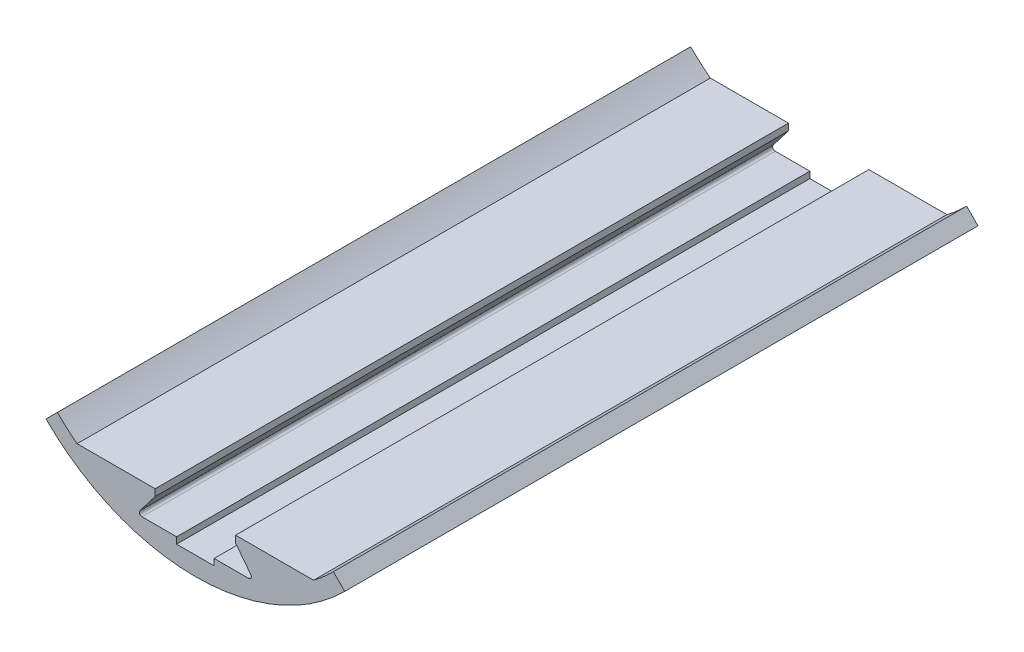
ISO-10303-21;
HEADER;
FILE_DESCRIPTION(('STEP AP214'),'2;1');
FILE_NAME('part.step','',(''),(''),'','','');
FILE_SCHEMA(('AUTOMOTIVE_DESIGN { 1 0 10303 214 1 1 1 1 }'));
ENDSEC;
DATA;
#1=APPLICATION_CONTEXT('core data for automotive mechanical design processes');
#2=APPLICATION_PROTOCOL_DEFINITION('international standard','automotive_design',2000,#1);
#3=PRODUCT_CONTEXT('',#1,'mechanical');
#4=PRODUCT('Part','Part','',(#3));
#5=PRODUCT_RELATED_PRODUCT_CATEGORY('part','',(#4));
#6=PRODUCT_DEFINITION_FORMATION('','',#4);
#7=PRODUCT_DEFINITION_CONTEXT('part definition',#1,'design');
#8=PRODUCT_DEFINITION('design','',#6,#7);
#9=PRODUCT_DEFINITION_SHAPE('','',#8);
#10=(LENGTH_UNIT() NAMED_UNIT(*) SI_UNIT(.MILLI.,.METRE.));
#11=(NAMED_UNIT(*) PLANE_ANGLE_UNIT() SI_UNIT($,.RADIAN.));
#12=(NAMED_UNIT(*) SI_UNIT($,.STERADIAN.) SOLID_ANGLE_UNIT());
#13=UNCERTAINTY_MEASURE_WITH_UNIT(LENGTH_MEASURE(1.E-05),#10,'distance_accuracy_value','');
#14=(GEOMETRIC_REPRESENTATION_CONTEXT(3) GLOBAL_UNCERTAINTY_ASSIGNED_CONTEXT((#13)) GLOBAL_UNIT_ASSIGNED_CONTEXT((#10,
#11,#12)) REPRESENTATION_CONTEXT('',''));
#15=CARTESIAN_POINT('',(0.,0.,0.));
#16=DIRECTION('',(0.,0.,1.));
#17=DIRECTION('',(1.,0.,0.));
#18=AXIS2_PLACEMENT_3D('',#15,#16,#17);
#19=CARTESIAN_POINT('',(0.,0.,-150.));
#20=DIRECTION('',(0.,0.,1.));
#21=DIRECTION('',(1.,0.,0.));
#22=AXIS2_PLACEMENT_3D('',#19,#20,#21);
#23=CYLINDRICAL_SURFACE('',#22,46.228);
#24=DIRECTION('',(0.,0.,1.));
#25=VECTOR('',#24,1.);
#26=CARTESIAN_POINT('',(28.0112005990461,-36.775,-206.814334854859));
#27=LINE('',#26,#25);
#28=CARTESIAN_POINT('',(28.0112005990461,-36.775,-150.));
#29=VERTEX_POINT('',#28);
#30=CARTESIAN_POINT('',(28.0112005990461,-36.775,0.));
#31=VERTEX_POINT('',#30);
#32=EDGE_CURVE('E177',#29,#31,#27,.T.);
#33=ORIENTED_EDGE('',*,*,#32,.T.);
#34=CARTESIAN_POINT('',(0.,0.,0.));
#35=DIRECTION('',(0.,0.,1.));
#36=DIRECTION('',(1.,0.,0.));
#37=AXIS2_PLACEMENT_3D('',#34,#35,#36);
#38=CIRCLE('',#37,46.228);
#39=CARTESIAN_POINT('',(32.6881322806918,-32.6881322806917,0.));
#40=VERTEX_POINT('',#39);
#41=EDGE_CURVE('E164',#31,#40,#38,.T.);
#42=ORIENTED_EDGE('',*,*,#41,.T.);
#43=DIRECTION('',(0.,0.,1.));
#44=VECTOR('',#43,1.);
#45=CARTESIAN_POINT('',(32.6881322806918,-32.6881322806917,-150.));
#46=LINE('',#45,#44);
#47=CARTESIAN_POINT('',(32.6881322806918,-32.6881322806917,-150.));
#48=VERTEX_POINT('',#47);
#49=EDGE_CURVE('E45',#48,#40,#46,.T.);
#50=ORIENTED_EDGE('',*,*,#49,.F.);
#51=CARTESIAN_POINT('',(0.,0.,-150.));
#52=DIRECTION('',(0.,0.,1.));
#53=DIRECTION('',(1.,0.,0.));
#54=AXIS2_PLACEMENT_3D('',#51,#52,#53);
#55=CIRCLE('',#54,46.228);
#56=EDGE_CURVE('E53',#29,#48,#55,.T.);
#57=ORIENTED_EDGE('',*,*,#56,.F.);
#58=EDGE_LOOP('',(#33,#42,#50,#57));
#59=FACE_BOUND('',#58,.T.);
#60=ADVANCED_FACE('F36',(#59),#23,.F.);
#61=DIRECTION('',(0.,0.,1.));
#62=VECTOR('',#61,1.);
#63=CARTESIAN_POINT('',(-28.0112005990461,-36.775,-206.814334854859));
#64=LINE('',#63,#62);
#65=CARTESIAN_POINT('',(-28.0112005990461,-36.775,-150.));
#66=VERTEX_POINT('',#65);
#67=CARTESIAN_POINT('',(-28.0112005990461,-36.775,0.));
#68=VERTEX_POINT('',#67);
#69=EDGE_CURVE('E61',#66,#68,#64,.T.);
#70=ORIENTED_EDGE('',*,*,#69,.F.);
#71=CARTESIAN_POINT('',(-32.6881322806918,-32.6881322806916,-150.));
#72=VERTEX_POINT('',#71);
#73=EDGE_CURVE('E260',#72,#66,#55,.T.);
#74=ORIENTED_EDGE('',*,*,#73,.F.);
#75=DIRECTION('',(0.,0.,1.));
#76=VECTOR('',#75,1.);
#77=CARTESIAN_POINT('',(-32.6881322806918,-32.6881322806916,-150.));
#78=LINE('',#77,#76);
#79=CARTESIAN_POINT('',(-32.6881322806918,-32.6881322806916,0.));
#80=VERTEX_POINT('',#79);
#81=EDGE_CURVE('E11',#72,#80,#78,.T.);
#82=ORIENTED_EDGE('',*,*,#81,.T.);
#83=EDGE_CURVE('E174',#80,#68,#38,.T.);
#84=ORIENTED_EDGE('',*,*,#83,.T.);
#85=EDGE_LOOP('',(#70,#74,#82,#84));
#86=FACE_BOUND('',#85,.T.);
#87=ADVANCED_FACE('F279',(#86),#23,.F.);
#88=CARTESIAN_POINT('',(-32.6881322806918,-32.6881322806917,-150.));
#89=DIRECTION('',(-0.707106781186544,0.707106781186551,0.));
#90=DIRECTION('',(-0.707106781186551,-0.707106781186544,0.));
#91=AXIS2_PLACEMENT_3D('',#88,#89,#90);
#92=PLANE('',#91);
#93=DIRECTION('',(-0.707106781186551,-0.707106781186544,0.));
#94=VECTOR('',#93,1.);
#95=CARTESIAN_POINT('',(-32.6881322806918,-32.6881322806917,0.));
#96=LINE('',#95,#94);
#97=CARTESIAN_POINT('',(-35.3822091170125,-35.3822091170124,0.));
#98=VERTEX_POINT('',#97);
#99=EDGE_CURVE('E262',#80,#98,#96,.T.);
#100=ORIENTED_EDGE('',*,*,#99,.F.);
#101=ORIENTED_EDGE('',*,*,#81,.F.);
#102=DIRECTION('',(-0.707106781186551,-0.707106781186544,0.));
#103=VECTOR('',#102,1.);
#104=CARTESIAN_POINT('',(-32.6881322806918,-32.6881322806917,-150.));
#105=LINE('',#104,#103);
#106=CARTESIAN_POINT('',(-35.3822091170125,-35.3822091170124,-150.));
#107=VERTEX_POINT('',#106);
#108=EDGE_CURVE('E252',#72,#107,#105,.T.);
#109=ORIENTED_EDGE('',*,*,#108,.T.);
#110=DIRECTION('',(0.,0.,1.));
#111=VECTOR('',#110,1.);
#112=CARTESIAN_POINT('',(-35.3822091170125,-35.3822091170124,-150.));
#113=LINE('',#112,#111);
#114=EDGE_CURVE('E40',#107,#98,#113,.T.);
#115=ORIENTED_EDGE('',*,*,#114,.T.);
#116=EDGE_LOOP('',(#100,#101,#109,#115));
#117=FACE_BOUND('',#116,.T.);
#118=ADVANCED_FACE('F38',(#117),#92,.T.);
#119=CARTESIAN_POINT('',(32.6881322806918,-32.6881322806917,-150.));
#120=DIRECTION('',(-0.707106781186544,-0.707106781186551,0.));
#121=DIRECTION('',(0.707106781186551,-0.707106781186544,0.));
#122=AXIS2_PLACEMENT_3D('',#119,#120,#121);
#123=PLANE('',#122);
#124=DIRECTION('',(0.707106781186551,-0.707106781186544,0.));
#125=VECTOR('',#124,1.);
#126=CARTESIAN_POINT('',(32.6881322806918,-32.6881322806917,0.));
#127=LINE('',#126,#125);
#128=CARTESIAN_POINT('',(35.3822091170125,-35.3822091170124,0.));
#129=VERTEX_POINT('',#128);
#130=EDGE_CURVE('E172',#40,#129,#127,.T.);
#131=ORIENTED_EDGE('',*,*,#130,.T.);
#132=DIRECTION('',(0.,0.,1.));
#133=VECTOR('',#132,1.);
#134=CARTESIAN_POINT('',(35.3822091170125,-35.3822091170124,-150.));
#135=LINE('',#134,#133);
#136=CARTESIAN_POINT('',(35.3822091170125,-35.3822091170124,-150.));
#137=VERTEX_POINT('',#136);
#138=EDGE_CURVE('E267',#137,#129,#135,.T.);
#139=ORIENTED_EDGE('',*,*,#138,.F.);
#140=DIRECTION('',(0.707106781186551,-0.707106781186544,0.));
#141=VECTOR('',#140,1.);
#142=CARTESIAN_POINT('',(32.6881322806918,-32.6881322806917,-150.));
#143=LINE('',#142,#141);
#144=EDGE_CURVE('E258',#48,#137,#143,.T.);
#145=ORIENTED_EDGE('',*,*,#144,.F.);
#146=ORIENTED_EDGE('',*,*,#49,.T.);
#147=EDGE_LOOP('',(#131,#139,#145,#146));
#148=FACE_BOUND('',#147,.T.);
#149=ADVANCED_FACE('F374',(#148),#123,.F.);
#150=CARTESIAN_POINT('',(0.,0.,-150.));
#151=DIRECTION('',(0.,0.,1.));
#152=DIRECTION('',(1.,0.,0.));
#153=AXIS2_PLACEMENT_3D('',#150,#151,#152);
#154=CYLINDRICAL_SURFACE('',#153,50.038);
#155=CARTESIAN_POINT('',(0.,0.,0.));
#156=DIRECTION('',(0.,0.,1.));
#157=DIRECTION('',(1.,0.,0.));
#158=AXIS2_PLACEMENT_3D('',#155,#156,#157);
#159=CIRCLE('',#158,50.038);
#160=EDGE_CURVE('E264',#98,#129,#159,.T.);
#161=ORIENTED_EDGE('',*,*,#160,.F.);
#162=ORIENTED_EDGE('',*,*,#114,.F.);
#163=CARTESIAN_POINT('',(0.,0.,-150.));
#164=DIRECTION('',(0.,0.,1.));
#165=DIRECTION('',(1.,0.,0.));
#166=AXIS2_PLACEMENT_3D('',#163,#164,#165);
#167=CIRCLE('',#166,50.038);
#168=EDGE_CURVE('E255',#107,#137,#167,.T.);
#169=ORIENTED_EDGE('',*,*,#168,.T.);
#170=ORIENTED_EDGE('',*,*,#138,.T.);
#171=EDGE_LOOP('',(#161,#162,#169,#170));
#172=FACE_BOUND('',#171,.T.);
#173=ADVANCED_FACE('F275',(#172),#154,.T.);
#174=CARTESIAN_POINT('',(0.,0.,-150.));
#175=DIRECTION('',(0.,0.,1.));
#176=DIRECTION('',(1.,0.,0.));
#177=AXIS2_PLACEMENT_3D('',#174,#175,#176);
#178=PLANE('',#177);
#179=ORIENTED_EDGE('',*,*,#108,.F.);
#180=ORIENTED_EDGE('',*,*,#73,.T.);
#181=DIRECTION('',(-1.,0.,0.));
#182=VECTOR('',#181,1.);
#183=CARTESIAN_POINT('',(0.,-36.775,-150.));
#184=LINE('',#183,#182);
#185=CARTESIAN_POINT('',(-9.525,-36.775,-150.));
#186=VERTEX_POINT('',#185);
#187=EDGE_CURVE('E191',#186,#66,#184,.T.);
#188=ORIENTED_EDGE('',*,*,#187,.F.);
#189=DIRECTION('',(0.,1.,0.));
#190=VECTOR('',#189,1.);
#191=CARTESIAN_POINT('',(-9.52499999999996,0.,-150.));
#192=LINE('',#191,#190);
#193=CARTESIAN_POINT('',(-9.525,-38.3705108690056,-150.));
#194=VERTEX_POINT('',#193);
#195=EDGE_CURVE('E286',#194,#186,#192,.T.);
#196=ORIENTED_EDGE('',*,*,#195,.F.);
#197=DIRECTION('',(0.608761429008719,0.793353340291237,0.));
#198=VECTOR('',#197,1.);
#199=CARTESIAN_POINT('',(12.5364080058381,-9.61952419519505,-150.));
#200=LINE('',#199,#198);
#201=CARTESIAN_POINT('',(-13.1264004871215,-43.063947361585,-150.));
#202=VERTEX_POINT('',#201);
#203=EDGE_CURVE('E287',#202,#194,#200,.T.);
#204=ORIENTED_EDGE('',*,*,#203,.F.);
#205=CARTESIAN_POINT('',(-12.6226211160366,-43.4505108690056,-150.));
#206=DIRECTION('',(0.,0.,1.));
#207=DIRECTION('',(1.,0.,0.));
#208=AXIS2_PLACEMENT_3D('',#205,#206,#207);
#209=CIRCLE('',#208,0.635000000000001);
#210=CARTESIAN_POINT('',(-12.6226211160366,-44.0855108690056,-150.));
#211=VERTEX_POINT('',#210);
#212=EDGE_CURVE('E291',#211,#202,#209,.F.);
#213=ORIENTED_EDGE('',*,*,#212,.F.);
#214=DIRECTION('',(-1.,0.,0.));
#215=VECTOR('',#214,1.);
#216=CARTESIAN_POINT('',(0.,-44.0855108690056,-150.));
#217=LINE('',#216,#215);
#218=CARTESIAN_POINT('',(-4.445,-44.0855108690056,-150.));
#219=VERTEX_POINT('',#218);
#220=EDGE_CURVE('E296',#219,#211,#217,.T.);
#221=ORIENTED_EDGE('',*,*,#220,.F.);
#222=DIRECTION('',(0.,1.,0.));
#223=VECTOR('',#222,1.);
#224=CARTESIAN_POINT('',(-4.445,0.,-150.));
#225=LINE('',#224,#223);
#226=CARTESIAN_POINT('',(-4.445,-45.6095108690056,-150.));
#227=VERTEX_POINT('',#226);
#228=EDGE_CURVE('E299',#227,#219,#225,.T.);
#229=ORIENTED_EDGE('',*,*,#228,.F.);
#230=DIRECTION('',(-1.,0.,0.));
#231=VECTOR('',#230,1.);
#232=CARTESIAN_POINT('',(0.,-45.6095108690056,-150.));
#233=LINE('',#232,#231);
#234=CARTESIAN_POINT('',(4.445,-45.6095108690056,-150.));
#235=VERTEX_POINT('',#234);
#236=EDGE_CURVE('E302',#235,#227,#233,.T.);
#237=ORIENTED_EDGE('',*,*,#236,.F.);
#238=DIRECTION('',(0.,-1.,0.));
#239=VECTOR('',#238,1.);
#240=CARTESIAN_POINT('',(4.445,0.,-150.));
#241=LINE('',#240,#239);
#242=CARTESIAN_POINT('',(4.445,-44.0855108690056,-150.));
#243=VERTEX_POINT('',#242);
#244=EDGE_CURVE('E305',#243,#235,#241,.T.);
#245=ORIENTED_EDGE('',*,*,#244,.F.);
#246=DIRECTION('',(-1.,0.,0.));
#247=VECTOR('',#246,1.);
#248=CARTESIAN_POINT('',(0.,-44.0855108690056,-150.));
#249=LINE('',#248,#247);
#250=CARTESIAN_POINT('',(12.6226211160366,-44.0855108690056,-150.));
#251=VERTEX_POINT('',#250);
#252=EDGE_CURVE('E308',#251,#243,#249,.T.);
#253=ORIENTED_EDGE('',*,*,#252,.F.);
#254=CARTESIAN_POINT('',(12.6226211160366,-43.4505108690056,-150.));
#255=DIRECTION('',(0.,0.,1.));
#256=DIRECTION('',(1.,0.,0.));
#257=AXIS2_PLACEMENT_3D('',#254,#255,#256);
#258=CIRCLE('',#257,0.635000000000001);
#259=CARTESIAN_POINT('',(13.1264004871215,-43.063947361585,-150.));
#260=VERTEX_POINT('',#259);
#261=EDGE_CURVE('E311',#260,#251,#258,.F.);
#262=ORIENTED_EDGE('',*,*,#261,.F.);
#263=DIRECTION('',(0.608761429008719,-0.793353340291237,0.));
#264=VECTOR('',#263,1.);
#265=CARTESIAN_POINT('',(-12.5364080058381,-9.61952419519505,-150.));
#266=LINE('',#265,#264);
#267=CARTESIAN_POINT('',(9.525,-38.3705108690056,-150.));
#268=VERTEX_POINT('',#267);
#269=EDGE_CURVE('E314',#268,#260,#266,.T.);
#270=ORIENTED_EDGE('',*,*,#269,.F.);
#271=DIRECTION('',(0.,-1.,0.));
#272=VECTOR('',#271,1.);
#273=CARTESIAN_POINT('',(9.52499999999996,0.,-150.));
#274=LINE('',#273,#272);
#275=CARTESIAN_POINT('',(9.525,-36.775,-150.));
#276=VERTEX_POINT('',#275);
#277=EDGE_CURVE('E251',#276,#268,#274,.T.);
#278=ORIENTED_EDGE('',*,*,#277,.F.);
#279=DIRECTION('',(-1.,0.,0.));
#280=VECTOR('',#279,1.);
#281=CARTESIAN_POINT('',(0.,-36.775,-150.));
#282=LINE('',#281,#280);
#283=EDGE_CURVE('E226',#29,#276,#282,.T.);
#284=ORIENTED_EDGE('',*,*,#283,.F.);
#285=ORIENTED_EDGE('',*,*,#56,.T.);
#286=ORIENTED_EDGE('',*,*,#144,.T.);
#287=ORIENTED_EDGE('',*,*,#168,.F.);
#288=EDGE_LOOP('',(#179,#180,#188,#196,#204,#213,#221,#229,#237,#245,#253,#262,#270,#278,#284,
#285,#286,#287));
#289=FACE_BOUND('',#288,.T.);
#290=ADVANCED_FACE('F321',(#289),#178,.F.);
#291=CARTESIAN_POINT('',(0.,0.,0.));
#292=DIRECTION('',(0.,0.,1.));
#293=DIRECTION('',(1.,0.,0.));
#294=AXIS2_PLACEMENT_3D('',#291,#292,#293);
#295=PLANE('',#294);
#296=ORIENTED_EDGE('',*,*,#99,.T.);
#297=ORIENTED_EDGE('',*,*,#160,.T.);
#298=ORIENTED_EDGE('',*,*,#130,.F.);
#299=ORIENTED_EDGE('',*,*,#41,.F.);
#300=DIRECTION('',(1.,0.,0.));
#301=VECTOR('',#300,1.);
#302=CARTESIAN_POINT('',(0.,-36.775,0.));
#303=LINE('',#302,#301);
#304=CARTESIAN_POINT('',(9.525,-36.775,0.));
#305=VERTEX_POINT('',#304);
#306=EDGE_CURVE('E169',#305,#31,#303,.T.);
#307=ORIENTED_EDGE('',*,*,#306,.F.);
#308=DIRECTION('',(0.,1.,0.));
#309=VECTOR('',#308,1.);
#310=CARTESIAN_POINT('',(9.52499999999996,0.,0.));
#311=LINE('',#310,#309);
#312=CARTESIAN_POINT('',(9.525,-38.3705108690056,0.));
#313=VERTEX_POINT('',#312);
#314=EDGE_CURVE('E186',#313,#305,#311,.T.);
#315=ORIENTED_EDGE('',*,*,#314,.F.);
#316=DIRECTION('',(-0.608761429008719,0.793353340291237,0.));
#317=VECTOR('',#316,1.);
#318=CARTESIAN_POINT('',(-12.5364080058381,-9.61952419519505,0.));
#319=LINE('',#318,#317);
#320=CARTESIAN_POINT('',(13.1264004871215,-43.063947361585,0.));
#321=VERTEX_POINT('',#320);
#322=EDGE_CURVE('E188',#321,#313,#319,.T.);
#323=ORIENTED_EDGE('',*,*,#322,.F.);
#324=CARTESIAN_POINT('',(12.6226211160366,-43.4505108690056,0.));
#325=DIRECTION('',(0.,0.,1.));
#326=DIRECTION('',(1.,0.,0.));
#327=AXIS2_PLACEMENT_3D('',#324,#325,#326);
#328=CIRCLE('',#327,0.635000000000001);
#329=CARTESIAN_POINT('',(12.6226211160366,-44.0855108690056,0.));
#330=VERTEX_POINT('',#329);
#331=EDGE_CURVE('E196',#330,#321,#328,.T.);
#332=ORIENTED_EDGE('',*,*,#331,.F.);
#333=DIRECTION('',(1.,0.,0.));
#334=VECTOR('',#333,1.);
#335=CARTESIAN_POINT('',(0.,-44.0855108690056,0.));
#336=LINE('',#335,#334);
#337=CARTESIAN_POINT('',(4.445,-44.0855108690056,0.));
#338=VERTEX_POINT('',#337);
#339=EDGE_CURVE('E199',#338,#330,#336,.T.);
#340=ORIENTED_EDGE('',*,*,#339,.F.);
#341=DIRECTION('',(0.,1.,0.));
#342=VECTOR('',#341,1.);
#343=CARTESIAN_POINT('',(4.445,0.,0.));
#344=LINE('',#343,#342);
#345=CARTESIAN_POINT('',(4.445,-45.6095108690056,0.));
#346=VERTEX_POINT('',#345);
#347=EDGE_CURVE('E202',#346,#338,#344,.T.);
#348=ORIENTED_EDGE('',*,*,#347,.F.);
#349=DIRECTION('',(1.,0.,0.));
#350=VECTOR('',#349,1.);
#351=CARTESIAN_POINT('',(0.,-45.6095108690056,0.));
#352=LINE('',#351,#350);
#353=CARTESIAN_POINT('',(-4.445,-45.6095108690056,0.));
#354=VERTEX_POINT('',#353);
#355=EDGE_CURVE('E205',#354,#346,#352,.T.);
#356=ORIENTED_EDGE('',*,*,#355,.F.);
#357=DIRECTION('',(0.,-1.,0.));
#358=VECTOR('',#357,1.);
#359=CARTESIAN_POINT('',(-4.445,0.,0.));
#360=LINE('',#359,#358);
#361=CARTESIAN_POINT('',(-4.445,-44.0855108690056,0.));
#362=VERTEX_POINT('',#361);
#363=EDGE_CURVE('E208',#362,#354,#360,.T.);
#364=ORIENTED_EDGE('',*,*,#363,.F.);
#365=DIRECTION('',(1.,0.,0.));
#366=VECTOR('',#365,1.);
#367=CARTESIAN_POINT('',(0.,-44.0855108690056,0.));
#368=LINE('',#367,#366);
#369=CARTESIAN_POINT('',(-12.6226211160366,-44.0855108690056,0.));
#370=VERTEX_POINT('',#369);
#371=EDGE_CURVE('E211',#370,#362,#368,.T.);
#372=ORIENTED_EDGE('',*,*,#371,.F.);
#373=CARTESIAN_POINT('',(-12.6226211160366,-43.4505108690056,0.));
#374=DIRECTION('',(0.,0.,1.));
#375=DIRECTION('',(1.,0.,0.));
#376=AXIS2_PLACEMENT_3D('',#373,#374,#375);
#377=CIRCLE('',#376,0.635000000000001);
#378=CARTESIAN_POINT('',(-13.1264004871215,-43.063947361585,0.));
#379=VERTEX_POINT('',#378);
#380=EDGE_CURVE('E214',#379,#370,#377,.T.);
#381=ORIENTED_EDGE('',*,*,#380,.F.);
#382=DIRECTION('',(-0.608761429008719,-0.793353340291237,0.));
#383=VECTOR('',#382,1.);
#384=CARTESIAN_POINT('',(12.5364080058381,-9.61952419519505,0.));
#385=LINE('',#384,#383);
#386=CARTESIAN_POINT('',(-9.525,-38.3705108690056,0.));
#387=VERTEX_POINT('',#386);
#388=EDGE_CURVE('E217',#387,#379,#385,.T.);
#389=ORIENTED_EDGE('',*,*,#388,.F.);
#390=DIRECTION('',(0.,-1.,0.));
#391=VECTOR('',#390,1.);
#392=CARTESIAN_POINT('',(-9.52499999999996,0.,0.));
#393=LINE('',#392,#391);
#394=CARTESIAN_POINT('',(-9.525,-36.775,0.));
#395=VERTEX_POINT('',#394);
#396=EDGE_CURVE('E220',#395,#387,#393,.T.);
#397=ORIENTED_EDGE('',*,*,#396,.F.);
#398=DIRECTION('',(1.,0.,0.));
#399=VECTOR('',#398,1.);
#400=CARTESIAN_POINT('',(0.,-36.775,0.));
#401=LINE('',#400,#399);
#402=EDGE_CURVE('E181',#68,#395,#401,.T.);
#403=ORIENTED_EDGE('',*,*,#402,.F.);
#404=ORIENTED_EDGE('',*,*,#83,.F.);
#405=EDGE_LOOP('',(#296,#297,#298,#299,#307,#315,#323,#332,#340,#348,#356,#364,#372,#381,#389,
#397,#403,#404));
#406=FACE_BOUND('',#405,.T.);
#407=ADVANCED_FACE('F166',(#406),#295,.T.);
#408=CARTESIAN_POINT('',(0.,-36.775,-206.814334854859));
#409=DIRECTION('',(0.,-1.,0.));
#410=DIRECTION('',(0.,0.,-1.));
#411=AXIS2_PLACEMENT_3D('',#408,#409,#410);
#412=PLANE('',#411);
#413=ORIENTED_EDGE('',*,*,#32,.F.);
#414=ORIENTED_EDGE('',*,*,#283,.T.);
#415=DIRECTION('',(0.,0.,1.));
#416=VECTOR('',#415,1.);
#417=CARTESIAN_POINT('',(9.525,-36.775,-206.814334854859));
#418=LINE('',#417,#416);
#419=EDGE_CURVE('E180',#276,#305,#418,.T.);
#420=ORIENTED_EDGE('',*,*,#419,.T.);
#421=ORIENTED_EDGE('',*,*,#306,.T.);
#422=EDGE_LOOP('',(#413,#414,#420,#421));
#423=FACE_BOUND('',#422,.T.);
#424=ADVANCED_FACE('F183',(#423),#412,.F.);
#425=CARTESIAN_POINT('',(9.52499999999996,0.,-206.814334854859));
#426=DIRECTION('',(1.,0.,0.));
#427=DIRECTION('',(0.,1.,0.));
#428=AXIS2_PLACEMENT_3D('',#425,#426,#427);
#429=PLANE('',#428);
#430=ORIENTED_EDGE('',*,*,#419,.F.);
#431=ORIENTED_EDGE('',*,*,#277,.T.);
#432=DIRECTION('',(0.,0.,1.));
#433=VECTOR('',#432,1.);
#434=CARTESIAN_POINT('',(9.525,-38.3705108690056,-206.814334854859));
#435=LINE('',#434,#433);
#436=EDGE_CURVE('E247',#268,#313,#435,.T.);
#437=ORIENTED_EDGE('',*,*,#436,.T.);
#438=ORIENTED_EDGE('',*,*,#314,.T.);
#439=EDGE_LOOP('',(#430,#431,#437,#438));
#440=FACE_BOUND('',#439,.T.);
#441=ADVANCED_FACE('F319',(#440),#429,.F.);
#442=CARTESIAN_POINT('',(-12.5364080058381,-9.61952419519505,-206.814334854859));
#443=DIRECTION('',(0.793353340291237,0.608761429008719,0.));
#444=DIRECTION('',(-0.608761429008719,0.793353340291237,0.));
#445=AXIS2_PLACEMENT_3D('',#442,#443,#444);
#446=PLANE('',#445);
#447=ORIENTED_EDGE('',*,*,#436,.F.);
#448=ORIENTED_EDGE('',*,*,#269,.T.);
#449=DIRECTION('',(0.,0.,1.));
#450=VECTOR('',#449,1.);
#451=CARTESIAN_POINT('',(13.1264004871215,-43.063947361585,-206.814334854859));
#452=LINE('',#451,#450);
#453=EDGE_CURVE('E245',#260,#321,#452,.T.);
#454=ORIENTED_EDGE('',*,*,#453,.T.);
#455=ORIENTED_EDGE('',*,*,#322,.T.);
#456=EDGE_LOOP('',(#447,#448,#454,#455));
#457=FACE_BOUND('',#456,.T.);
#458=ADVANCED_FACE('F324',(#457),#446,.F.);
#459=CARTESIAN_POINT('',(12.6226211160366,-43.4505108690056,-206.814334854859));
#460=DIRECTION('',(0.,0.,1.));
#461=DIRECTION('',(1.,0.,0.));
#462=AXIS2_PLACEMENT_3D('',#459,#460,#461);
#463=CYLINDRICAL_SURFACE('',#462,0.635000000000001);
#464=ORIENTED_EDGE('',*,*,#453,.F.);
#465=ORIENTED_EDGE('',*,*,#261,.T.);
#466=DIRECTION('',(0.,0.,1.));
#467=VECTOR('',#466,1.);
#468=CARTESIAN_POINT('',(12.6226211160366,-44.0855108690056,-206.814334854859));
#469=LINE('',#468,#467);
#470=EDGE_CURVE('E243',#251,#330,#469,.T.);
#471=ORIENTED_EDGE('',*,*,#470,.T.);
#472=ORIENTED_EDGE('',*,*,#331,.T.);
#473=EDGE_LOOP('',(#464,#465,#471,#472));
#474=FACE_BOUND('',#473,.T.);
#475=ADVANCED_FACE('F330',(#474),#463,.F.);
#476=CARTESIAN_POINT('',(0.,-44.0855108690056,-206.814334854859));
#477=DIRECTION('',(0.,-1.,0.));
#478=DIRECTION('',(0.,0.,-1.));
#479=AXIS2_PLACEMENT_3D('',#476,#477,#478);
#480=PLANE('',#479);
#481=ORIENTED_EDGE('',*,*,#470,.F.);
#482=ORIENTED_EDGE('',*,*,#252,.T.);
#483=DIRECTION('',(0.,0.,1.));
#484=VECTOR('',#483,1.);
#485=CARTESIAN_POINT('',(4.445,-44.0855108690056,-206.814334854859));
#486=LINE('',#485,#484);
#487=EDGE_CURVE('E241',#243,#338,#486,.T.);
#488=ORIENTED_EDGE('',*,*,#487,.T.);
#489=ORIENTED_EDGE('',*,*,#339,.T.);
#490=EDGE_LOOP('',(#481,#482,#488,#489));
#491=FACE_BOUND('',#490,.T.);
#492=ADVANCED_FACE('F333',(#491),#480,.F.);
#493=CARTESIAN_POINT('',(4.445,0.,-206.814334854859));
#494=DIRECTION('',(1.,0.,0.));
#495=DIRECTION('',(0.,0.,-1.));
#496=AXIS2_PLACEMENT_3D('',#493,#494,#495);
#497=PLANE('',#496);
#498=ORIENTED_EDGE('',*,*,#487,.F.);
#499=ORIENTED_EDGE('',*,*,#244,.T.);
#500=DIRECTION('',(0.,0.,1.));
#501=VECTOR('',#500,1.);
#502=CARTESIAN_POINT('',(4.445,-45.6095108690056,-206.814334854859));
#503=LINE('',#502,#501);
#504=EDGE_CURVE('E239',#235,#346,#503,.T.);
#505=ORIENTED_EDGE('',*,*,#504,.T.);
#506=ORIENTED_EDGE('',*,*,#347,.T.);
#507=EDGE_LOOP('',(#498,#499,#505,#506));
#508=FACE_BOUND('',#507,.T.);
#509=ADVANCED_FACE('F336',(#508),#497,.F.);
#510=CARTESIAN_POINT('',(0.,-45.6095108690056,-206.814334854859));
#511=DIRECTION('',(0.,-1.,0.));
#512=DIRECTION('',(0.,0.,-1.));
#513=AXIS2_PLACEMENT_3D('',#510,#511,#512);
#514=PLANE('',#513);
#515=ORIENTED_EDGE('',*,*,#504,.F.);
#516=ORIENTED_EDGE('',*,*,#236,.T.);
#517=DIRECTION('',(0.,0.,1.));
#518=VECTOR('',#517,1.);
#519=CARTESIAN_POINT('',(-4.445,-45.6095108690056,-206.814334854859));
#520=LINE('',#519,#518);
#521=EDGE_CURVE('E237',#227,#354,#520,.T.);
#522=ORIENTED_EDGE('',*,*,#521,.T.);
#523=ORIENTED_EDGE('',*,*,#355,.T.);
#524=EDGE_LOOP('',(#515,#516,#522,#523));
#525=FACE_BOUND('',#524,.T.);
#526=ADVANCED_FACE('F342',(#525),#514,.F.);
#527=CARTESIAN_POINT('',(-4.445,0.,-206.814334854859));
#528=DIRECTION('',(-1.,0.,0.));
#529=DIRECTION('',(0.,0.,1.));
#530=AXIS2_PLACEMENT_3D('',#527,#528,#529);
#531=PLANE('',#530);
#532=ORIENTED_EDGE('',*,*,#521,.F.);
#533=ORIENTED_EDGE('',*,*,#228,.T.);
#534=DIRECTION('',(0.,0.,1.));
#535=VECTOR('',#534,1.);
#536=CARTESIAN_POINT('',(-4.445,-44.0855108690056,-206.814334854859));
#537=LINE('',#536,#535);
#538=EDGE_CURVE('E235',#219,#362,#537,.T.);
#539=ORIENTED_EDGE('',*,*,#538,.T.);
#540=ORIENTED_EDGE('',*,*,#363,.T.);
#541=EDGE_LOOP('',(#532,#533,#539,#540));
#542=FACE_BOUND('',#541,.T.);
#543=ADVANCED_FACE('F345',(#542),#531,.F.);
#544=CARTESIAN_POINT('',(0.,-44.0855108690056,-206.814334854859));
#545=DIRECTION('',(0.,-1.,0.));
#546=DIRECTION('',(0.,0.,-1.));
#547=AXIS2_PLACEMENT_3D('',#544,#545,#546);
#548=PLANE('',#547);
#549=ORIENTED_EDGE('',*,*,#538,.F.);
#550=ORIENTED_EDGE('',*,*,#220,.T.);
#551=DIRECTION('',(0.,0.,1.));
#552=VECTOR('',#551,1.);
#553=CARTESIAN_POINT('',(-12.6226211160366,-44.0855108690056,-206.814334854859));
#554=LINE('',#553,#552);
#555=EDGE_CURVE('E233',#211,#370,#554,.T.);
#556=ORIENTED_EDGE('',*,*,#555,.T.);
#557=ORIENTED_EDGE('',*,*,#371,.T.);
#558=EDGE_LOOP('',(#549,#550,#556,#557));
#559=FACE_BOUND('',#558,.T.);
#560=ADVANCED_FACE('F348',(#559),#548,.F.);
#561=CARTESIAN_POINT('',(-12.6226211160366,-43.4505108690056,-206.814334854859));
#562=DIRECTION('',(0.,0.,1.));
#563=DIRECTION('',(1.,0.,0.));
#564=AXIS2_PLACEMENT_3D('',#561,#562,#563);
#565=CYLINDRICAL_SURFACE('',#564,0.635000000000001);
#566=ORIENTED_EDGE('',*,*,#555,.F.);
#567=ORIENTED_EDGE('',*,*,#212,.T.);
#568=DIRECTION('',(0.,0.,1.));
#569=VECTOR('',#568,1.);
#570=CARTESIAN_POINT('',(-13.1264004871215,-43.063947361585,-206.814334854859));
#571=LINE('',#570,#569);
#572=EDGE_CURVE('E231',#202,#379,#571,.T.);
#573=ORIENTED_EDGE('',*,*,#572,.T.);
#574=ORIENTED_EDGE('',*,*,#380,.T.);
#575=EDGE_LOOP('',(#566,#567,#573,#574));
#576=FACE_BOUND('',#575,.T.);
#577=ADVANCED_FACE('F353',(#576),#565,.F.);
#578=CARTESIAN_POINT('',(12.5364080058381,-9.61952419519505,-206.814334854859));
#579=DIRECTION('',(-0.793353340291237,0.608761429008719,0.));
#580=DIRECTION('',(-0.608761429008719,-0.793353340291237,0.));
#581=AXIS2_PLACEMENT_3D('',#578,#579,#580);
#582=PLANE('',#581);
#583=ORIENTED_EDGE('',*,*,#572,.F.);
#584=ORIENTED_EDGE('',*,*,#203,.T.);
#585=DIRECTION('',(0.,0.,1.));
#586=VECTOR('',#585,1.);
#587=CARTESIAN_POINT('',(-9.525,-38.3705108690056,-206.814334854859));
#588=LINE('',#587,#586);
#589=EDGE_CURVE('E229',#194,#387,#588,.T.);
#590=ORIENTED_EDGE('',*,*,#589,.T.);
#591=ORIENTED_EDGE('',*,*,#388,.T.);
#592=EDGE_LOOP('',(#583,#584,#590,#591));
#593=FACE_BOUND('',#592,.T.);
#594=ADVANCED_FACE('F356',(#593),#582,.F.);
#595=CARTESIAN_POINT('',(-9.52499999999996,0.,-206.814334854859));
#596=DIRECTION('',(-1.,0.,0.));
#597=DIRECTION('',(0.,-1.,0.));
#598=AXIS2_PLACEMENT_3D('',#595,#596,#597);
#599=PLANE('',#598);
#600=ORIENTED_EDGE('',*,*,#589,.F.);
#601=ORIENTED_EDGE('',*,*,#195,.T.);
#602=DIRECTION('',(0.,0.,1.));
#603=VECTOR('',#602,1.);
#604=CARTESIAN_POINT('',(-9.525,-36.775,-206.814334854859));
#605=LINE('',#604,#603);
#606=EDGE_CURVE('E227',#186,#395,#605,.T.);
#607=ORIENTED_EDGE('',*,*,#606,.T.);
#608=ORIENTED_EDGE('',*,*,#396,.T.);
#609=EDGE_LOOP('',(#600,#601,#607,#608));
#610=FACE_BOUND('',#609,.T.);
#611=ADVANCED_FACE('F357',(#610),#599,.F.);
#612=CARTESIAN_POINT('',(0.,-36.775,-206.814334854859));
#613=DIRECTION('',(0.,-1.,0.));
#614=DIRECTION('',(0.,0.,-1.));
#615=AXIS2_PLACEMENT_3D('',#612,#613,#614);
#616=PLANE('',#615);
#617=ORIENTED_EDGE('',*,*,#606,.F.);
#618=ORIENTED_EDGE('',*,*,#187,.T.);
#619=ORIENTED_EDGE('',*,*,#69,.T.);
#620=ORIENTED_EDGE('',*,*,#402,.T.);
#621=EDGE_LOOP('',(#617,#618,#619,#620));
#622=FACE_BOUND('',#621,.T.);
#623=ADVANCED_FACE('F283',(#622),#616,.F.);
#624=CLOSED_SHELL('',(#60,#87,#118,#149,#173,#290,#407,#424,#441,#458,#475,#492,#509,#526,#543,
#560,#577,#594,#611,#623));
#625=MANIFOLD_SOLID_BREP('B2',#624);
#626=ADVANCED_BREP_SHAPE_REPRESENTATION('',(#18,#625),#14);
#627=SHAPE_DEFINITION_REPRESENTATION(#9,#626);
ENDSEC;
END-ISO-10303-21;
